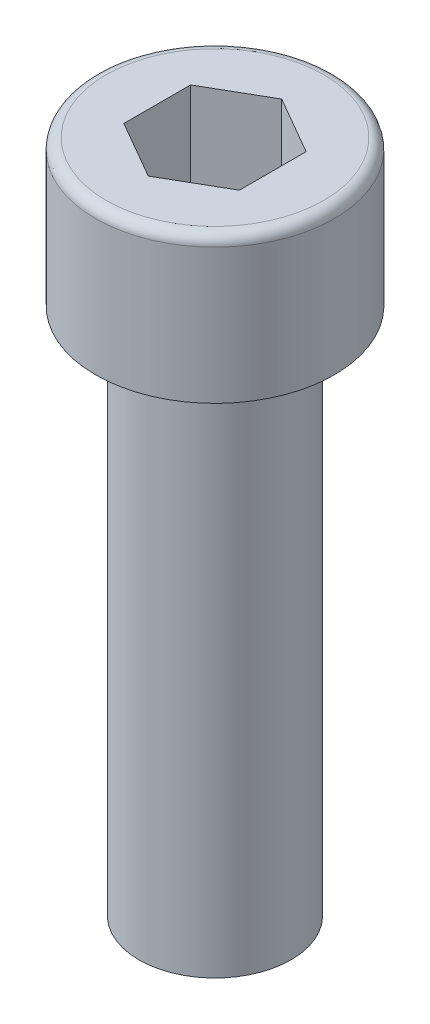
ISO-10303-21;
HEADER;
FILE_DESCRIPTION(('STEP AP214'),'2;1');
FILE_NAME('part.step','',(''),(''),'','','');
FILE_SCHEMA(('AUTOMOTIVE_DESIGN { 1 0 10303 214 1 1 1 1 }'));
ENDSEC;
DATA;
#1=APPLICATION_CONTEXT('core data for automotive mechanical design processes');
#2=APPLICATION_PROTOCOL_DEFINITION('international standard','automotive_design',2000,#1);
#3=PRODUCT_CONTEXT('',#1,'mechanical');
#4=PRODUCT('Part','Part','',(#3));
#5=PRODUCT_RELATED_PRODUCT_CATEGORY('part','',(#4));
#6=PRODUCT_DEFINITION_FORMATION('','',#4);
#7=PRODUCT_DEFINITION_CONTEXT('part definition',#1,'design');
#8=PRODUCT_DEFINITION('design','',#6,#7);
#9=PRODUCT_DEFINITION_SHAPE('','',#8);
#10=(LENGTH_UNIT() NAMED_UNIT(*) SI_UNIT(.MILLI.,.METRE.));
#11=(NAMED_UNIT(*) PLANE_ANGLE_UNIT() SI_UNIT($,.RADIAN.));
#12=(NAMED_UNIT(*) SI_UNIT($,.STERADIAN.) SOLID_ANGLE_UNIT());
#13=UNCERTAINTY_MEASURE_WITH_UNIT(LENGTH_MEASURE(1.E-05),#10,'distance_accuracy_value','');
#14=(GEOMETRIC_REPRESENTATION_CONTEXT(3) GLOBAL_UNCERTAINTY_ASSIGNED_CONTEXT((#13)) GLOBAL_UNIT_ASSIGNED_CONTEXT((#10,
#11,#12)) REPRESENTATION_CONTEXT('',''));
#15=CARTESIAN_POINT('',(0.,0.,0.));
#16=DIRECTION('',(0.,0.,1.));
#17=DIRECTION('',(1.,0.,0.));
#18=AXIS2_PLACEMENT_3D('',#15,#16,#17);
#19=CARTESIAN_POINT('',(0.,-12.7,0.));
#20=DIRECTION('',(0.,1.,0.));
#21=DIRECTION('',(0.,0.,1.));
#22=AXIS2_PLACEMENT_3D('',#19,#20,#21);
#23=CYLINDRICAL_SURFACE('',#22,1.8288);
#24=CARTESIAN_POINT('',(0.,-12.7,0.));
#25=DIRECTION('',(0.,1.,0.));
#26=DIRECTION('',(0.,0.,1.));
#27=AXIS2_PLACEMENT_3D('',#24,#25,#26);
#28=CIRCLE('',#27,1.8288);
#29=CARTESIAN_POINT('',(0.,-12.7,1.8288));
#30=VERTEX_POINT('',#29);
#31=EDGE_CURVE('E143',#30,#30,#28,.T.);
#32=ORIENTED_EDGE('',*,*,#31,.T.);
#33=EDGE_LOOP('',(#32));
#34=FACE_BOUND('',#33,.T.);
#35=CARTESIAN_POINT('',(0.,0.,0.));
#36=DIRECTION('',(0.,1.,0.));
#37=DIRECTION('',(0.,0.,1.));
#38=AXIS2_PLACEMENT_3D('',#35,#36,#37);
#39=CIRCLE('',#38,1.8288);
#40=CARTESIAN_POINT('',(0.,0.,1.8288));
#41=VERTEX_POINT('',#40);
#42=EDGE_CURVE('E142',#41,#41,#39,.T.);
#43=ORIENTED_EDGE('',*,*,#42,.F.);
#44=EDGE_LOOP('',(#43));
#45=FACE_BOUND('',#44,.T.);
#46=ADVANCED_FACE('F32',(#34,#45),#23,.T.);
#47=CARTESIAN_POINT('',(0.,-12.7,0.));
#48=DIRECTION('',(0.,1.,0.));
#49=DIRECTION('',(0.,0.,1.));
#50=AXIS2_PLACEMENT_3D('',#47,#48,#49);
#51=PLANE('',#50);
#52=ORIENTED_EDGE('',*,*,#31,.F.);
#53=EDGE_LOOP('',(#52));
#54=FACE_BOUND('',#53,.T.);
#55=ADVANCED_FACE('F166',(#54),#51,.F.);
#56=CARTESIAN_POINT('',(0.,3.5052,0.));
#57=DIRECTION('',(0.,-1.,0.));
#58=DIRECTION('',(0.,0.,-1.));
#59=AXIS2_PLACEMENT_3D('',#56,#57,#58);
#60=CYLINDRICAL_SURFACE('',#59,2.8702);
#61=CARTESIAN_POINT('',(0.,3.2512,0.));
#62=DIRECTION('',(0.,1.,0.));
#63=DIRECTION('',(0.,0.,1.));
#64=AXIS2_PLACEMENT_3D('',#61,#62,#63);
#65=CIRCLE('',#64,2.8702);
#66=CARTESIAN_POINT('',(0.,3.2512,2.8702));
#67=VERTEX_POINT('',#66);
#68=EDGE_CURVE('E11',#67,#67,#65,.F.);
#69=ORIENTED_EDGE('',*,*,#68,.T.);
#70=EDGE_LOOP('',(#69));
#71=FACE_BOUND('',#70,.T.);
#72=CARTESIAN_POINT('',(0.,0.,0.));
#73=DIRECTION('',(0.,1.,0.));
#74=DIRECTION('',(0.,0.,1.));
#75=AXIS2_PLACEMENT_3D('',#72,#73,#74);
#76=CIRCLE('',#75,2.8702);
#77=CARTESIAN_POINT('',(0.,0.,2.8702));
#78=VERTEX_POINT('',#77);
#79=EDGE_CURVE('E134',#78,#78,#76,.T.);
#80=ORIENTED_EDGE('',*,*,#79,.T.);
#81=EDGE_LOOP('',(#80));
#82=FACE_BOUND('',#81,.T.);
#83=ADVANCED_FACE('F171',(#71,#82),#60,.T.);
#84=CARTESIAN_POINT('',(0.,3.5052,0.));
#85=DIRECTION('',(0.,1.,0.));
#86=DIRECTION('',(0.,0.,1.));
#87=AXIS2_PLACEMENT_3D('',#84,#85,#86);
#88=PLANE('',#87);
#89=DIRECTION('',(-0.866025403784439,0.,-0.5));
#90=VECTOR('',#89,1.);
#91=CARTESIAN_POINT('',(1.3890625,3.5052,-0.801975608296215));
#92=LINE('',#91,#90);
#93=CARTESIAN_POINT('',(1.3890625,3.5052,-0.801975608296215));
#94=VERTEX_POINT('',#93);
#95=CARTESIAN_POINT('',(0.,3.5052,-1.60395121659243));
#96=VERTEX_POINT('',#95);
#97=EDGE_CURVE('E47',#94,#96,#92,.T.);
#98=ORIENTED_EDGE('',*,*,#97,.F.);
#99=DIRECTION('',(0.,0.,-1.));
#100=VECTOR('',#99,1.);
#101=CARTESIAN_POINT('',(1.3890625,3.5052,0.801975608296215));
#102=LINE('',#101,#100);
#103=CARTESIAN_POINT('',(1.3890625,3.5052,0.801975608296215));
#104=VERTEX_POINT('',#103);
#105=EDGE_CURVE('E130',#104,#94,#102,.T.);
#106=ORIENTED_EDGE('',*,*,#105,.F.);
#107=DIRECTION('',(0.866025403784439,0.,-0.5));
#108=VECTOR('',#107,1.);
#109=CARTESIAN_POINT('',(0.,3.5052,1.60395121659243));
#110=LINE('',#109,#108);
#111=CARTESIAN_POINT('',(0.,3.5052,1.60395121659243));
#112=VERTEX_POINT('',#111);
#113=EDGE_CURVE('E128',#112,#104,#110,.T.);
#114=ORIENTED_EDGE('',*,*,#113,.F.);
#115=DIRECTION('',(0.866025403784439,0.,0.5));
#116=VECTOR('',#115,1.);
#117=CARTESIAN_POINT('',(-1.3890625,3.5052,0.801975608296215));
#118=LINE('',#117,#116);
#119=CARTESIAN_POINT('',(-1.3890625,3.5052,0.801975608296215));
#120=VERTEX_POINT('',#119);
#121=EDGE_CURVE('E95',#120,#112,#118,.T.);
#122=ORIENTED_EDGE('',*,*,#121,.F.);
#123=DIRECTION('',(0.,0.,1.));
#124=VECTOR('',#123,1.);
#125=CARTESIAN_POINT('',(-1.3890625,3.5052,-0.801975608296215));
#126=LINE('',#125,#124);
#127=CARTESIAN_POINT('',(-1.3890625,3.5052,-0.801975608296215));
#128=VERTEX_POINT('',#127);
#129=EDGE_CURVE('E124',#128,#120,#126,.T.);
#130=ORIENTED_EDGE('',*,*,#129,.F.);
#131=DIRECTION('',(-0.866025403784439,0.,0.5));
#132=VECTOR('',#131,1.);
#133=CARTESIAN_POINT('',(0.,3.5052,-1.60395121659243));
#134=LINE('',#133,#132);
#135=EDGE_CURVE('E121',#96,#128,#134,.T.);
#136=ORIENTED_EDGE('',*,*,#135,.F.);
#137=EDGE_LOOP('',(#98,#106,#114,#122,#130,#136));
#138=FACE_BOUND('',#137,.T.);
#139=CARTESIAN_POINT('',(0.,3.5052,0.));
#140=DIRECTION('',(0.,1.,0.));
#141=DIRECTION('',(0.,0.,1.));
#142=AXIS2_PLACEMENT_3D('',#139,#140,#141);
#143=CIRCLE('',#142,2.6162);
#144=CARTESIAN_POINT('',(0.,3.5052,2.6162));
#145=VERTEX_POINT('',#144);
#146=EDGE_CURVE('E40',#145,#145,#143,.T.);
#147=ORIENTED_EDGE('',*,*,#146,.T.);
#148=EDGE_LOOP('',(#147));
#149=FACE_BOUND('',#148,.T.);
#150=ADVANCED_FACE('F150',(#138,#149),#88,.T.);
#151=CARTESIAN_POINT('',(0.,0.,0.));
#152=DIRECTION('',(0.,1.,0.));
#153=DIRECTION('',(0.,0.,1.));
#154=AXIS2_PLACEMENT_3D('',#151,#152,#153);
#155=PLANE('',#154);
#156=ORIENTED_EDGE('',*,*,#42,.T.);
#157=EDGE_LOOP('',(#156));
#158=FACE_BOUND('',#157,.T.);
#159=ORIENTED_EDGE('',*,*,#79,.F.);
#160=EDGE_LOOP('',(#159));
#161=FACE_BOUND('',#160,.T.);
#162=ADVANCED_FACE('F154',(#158,#161),#155,.F.);
#163=CARTESIAN_POINT('',(0.,3.2512,0.));
#164=DIRECTION('',(0.,1.,0.));
#165=DIRECTION('',(0.,0.,1.));
#166=AXIS2_PLACEMENT_3D('',#163,#164,#165);
#167=TOROIDAL_SURFACE('',#166,2.6162,0.254);
#168=ORIENTED_EDGE('',*,*,#68,.F.);
#169=EDGE_LOOP('',(#168));
#170=FACE_BOUND('',#169,.T.);
#171=ORIENTED_EDGE('',*,*,#146,.F.);
#172=EDGE_LOOP('',(#171));
#173=FACE_BOUND('',#172,.T.);
#174=ADVANCED_FACE('F34',(#170,#173),#167,.T.);
#175=CARTESIAN_POINT('',(1.3890625,0.9652,-0.801975608296215));
#176=DIRECTION('',(0.5,0.,-0.866025403784439));
#177=DIRECTION('',(-0.866025403784439,0.,-0.5));
#178=AXIS2_PLACEMENT_3D('',#175,#176,#177);
#179=PLANE('',#178);
#180=ORIENTED_EDGE('',*,*,#97,.T.);
#181=DIRECTION('',(0.,1.,0.));
#182=VECTOR('',#181,1.);
#183=CARTESIAN_POINT('',(0.,0.9652,-1.60395121659243));
#184=LINE('',#183,#182);
#185=CARTESIAN_POINT('',(0.,0.9652,-1.60395121659243));
#186=VERTEX_POINT('',#185);
#187=EDGE_CURVE('E77',#186,#96,#184,.T.);
#188=ORIENTED_EDGE('',*,*,#187,.F.);
#189=DIRECTION('',(-0.866025403784439,0.,-0.5));
#190=VECTOR('',#189,1.);
#191=CARTESIAN_POINT('',(1.3890625,0.9652,-0.801975608296215));
#192=LINE('',#191,#190);
#193=CARTESIAN_POINT('',(1.3890625,0.9652,-0.801975608296215));
#194=VERTEX_POINT('',#193);
#195=EDGE_CURVE('E132',#194,#186,#192,.T.);
#196=ORIENTED_EDGE('',*,*,#195,.F.);
#197=DIRECTION('',(0.,1.,0.));
#198=VECTOR('',#197,1.);
#199=CARTESIAN_POINT('',(1.3890625,0.9652,-0.801975608296215));
#200=LINE('',#199,#198);
#201=EDGE_CURVE('E55',#194,#94,#200,.T.);
#202=ORIENTED_EDGE('',*,*,#201,.T.);
#203=EDGE_LOOP('',(#180,#188,#196,#202));
#204=FACE_BOUND('',#203,.T.);
#205=ADVANCED_FACE('F153',(#204),#179,.F.);
#206=CARTESIAN_POINT('',(1.3890625,0.9652,0.801975608296215));
#207=DIRECTION('',(1.,0.,0.));
#208=DIRECTION('',(0.,0.,-1.));
#209=AXIS2_PLACEMENT_3D('',#206,#207,#208);
#210=PLANE('',#209);
#211=ORIENTED_EDGE('',*,*,#105,.T.);
#212=ORIENTED_EDGE('',*,*,#201,.F.);
#213=DIRECTION('',(0.,0.,-1.));
#214=VECTOR('',#213,1.);
#215=CARTESIAN_POINT('',(1.3890625,0.9652,0.801975608296215));
#216=LINE('',#215,#214);
#217=CARTESIAN_POINT('',(1.3890625,0.9652,0.801975608296215));
#218=VERTEX_POINT('',#217);
#219=EDGE_CURVE('E107',#218,#194,#216,.T.);
#220=ORIENTED_EDGE('',*,*,#219,.F.);
#221=DIRECTION('',(0.,1.,0.));
#222=VECTOR('',#221,1.);
#223=CARTESIAN_POINT('',(1.3890625,0.9652,0.801975608296215));
#224=LINE('',#223,#222);
#225=EDGE_CURVE('E99',#218,#104,#224,.T.);
#226=ORIENTED_EDGE('',*,*,#225,.T.);
#227=EDGE_LOOP('',(#211,#212,#220,#226));
#228=FACE_BOUND('',#227,.T.);
#229=ADVANCED_FACE('F160',(#228),#210,.F.);
#230=CARTESIAN_POINT('',(0.,0.9652,1.60395121659243));
#231=DIRECTION('',(0.5,0.,0.866025403784439));
#232=DIRECTION('',(0.866025403784439,0.,-0.5));
#233=AXIS2_PLACEMENT_3D('',#230,#231,#232);
#234=PLANE('',#233);
#235=ORIENTED_EDGE('',*,*,#113,.T.);
#236=ORIENTED_EDGE('',*,*,#225,.F.);
#237=DIRECTION('',(0.866025403784439,0.,-0.5));
#238=VECTOR('',#237,1.);
#239=CARTESIAN_POINT('',(0.,0.9652,1.60395121659243));
#240=LINE('',#239,#238);
#241=CARTESIAN_POINT('',(0.,0.9652,1.60395121659243));
#242=VERTEX_POINT('',#241);
#243=EDGE_CURVE('E103',#242,#218,#240,.T.);
#244=ORIENTED_EDGE('',*,*,#243,.F.);
#245=DIRECTION('',(0.,1.,0.));
#246=VECTOR('',#245,1.);
#247=CARTESIAN_POINT('',(0.,0.9652,1.60395121659243));
#248=LINE('',#247,#246);
#249=EDGE_CURVE('E88',#242,#112,#248,.T.);
#250=ORIENTED_EDGE('',*,*,#249,.T.);
#251=EDGE_LOOP('',(#235,#236,#244,#250));
#252=FACE_BOUND('',#251,.T.);
#253=ADVANCED_FACE('F104',(#252),#234,.F.);
#254=CARTESIAN_POINT('',(-1.3890625,0.9652,0.801975608296215));
#255=DIRECTION('',(-0.5,0.,0.866025403784439));
#256=DIRECTION('',(0.866025403784439,0.,0.5));
#257=AXIS2_PLACEMENT_3D('',#254,#255,#256);
#258=PLANE('',#257);
#259=ORIENTED_EDGE('',*,*,#121,.T.);
#260=ORIENTED_EDGE('',*,*,#249,.F.);
#261=DIRECTION('',(0.866025403784439,0.,0.5));
#262=VECTOR('',#261,1.);
#263=CARTESIAN_POINT('',(-1.3890625,0.9652,0.801975608296215));
#264=LINE('',#263,#262);
#265=CARTESIAN_POINT('',(-1.3890625,0.9652,0.801975608296215));
#266=VERTEX_POINT('',#265);
#267=EDGE_CURVE('E92',#266,#242,#264,.T.);
#268=ORIENTED_EDGE('',*,*,#267,.F.);
#269=DIRECTION('',(0.,1.,0.));
#270=VECTOR('',#269,1.);
#271=CARTESIAN_POINT('',(-1.3890625,0.9652,0.801975608296215));
#272=LINE('',#271,#270);
#273=EDGE_CURVE('E100',#266,#120,#272,.T.);
#274=ORIENTED_EDGE('',*,*,#273,.T.);
#275=EDGE_LOOP('',(#259,#260,#268,#274));
#276=FACE_BOUND('',#275,.T.);
#277=ADVANCED_FACE('F90',(#276),#258,.F.);
#278=CARTESIAN_POINT('',(-1.3890625,0.9652,-0.801975608296215));
#279=DIRECTION('',(-1.,0.,0.));
#280=DIRECTION('',(0.,0.,1.));
#281=AXIS2_PLACEMENT_3D('',#278,#279,#280);
#282=PLANE('',#281);
#283=ORIENTED_EDGE('',*,*,#129,.T.);
#284=ORIENTED_EDGE('',*,*,#273,.F.);
#285=DIRECTION('',(0.,0.,1.));
#286=VECTOR('',#285,1.);
#287=CARTESIAN_POINT('',(-1.3890625,0.9652,-0.801975608296215));
#288=LINE('',#287,#286);
#289=CARTESIAN_POINT('',(-1.3890625,0.9652,-0.801975608296215));
#290=VERTEX_POINT('',#289);
#291=EDGE_CURVE('E113',#290,#266,#288,.T.);
#292=ORIENTED_EDGE('',*,*,#291,.F.);
#293=DIRECTION('',(0.,1.,0.));
#294=VECTOR('',#293,1.);
#295=CARTESIAN_POINT('',(-1.3890625,0.9652,-0.801975608296215));
#296=LINE('',#295,#294);
#297=EDGE_CURVE('E137',#290,#128,#296,.T.);
#298=ORIENTED_EDGE('',*,*,#297,.T.);
#299=EDGE_LOOP('',(#283,#284,#292,#298));
#300=FACE_BOUND('',#299,.T.);
#301=ADVANCED_FACE('F185',(#300),#282,.F.);
#302=CARTESIAN_POINT('',(0.,0.9652,-1.60395121659243));
#303=DIRECTION('',(-0.5,0.,-0.866025403784439));
#304=DIRECTION('',(-0.866025403784439,0.,0.5));
#305=AXIS2_PLACEMENT_3D('',#302,#303,#304);
#306=PLANE('',#305);
#307=ORIENTED_EDGE('',*,*,#135,.T.);
#308=ORIENTED_EDGE('',*,*,#297,.F.);
#309=DIRECTION('',(-0.866025403784439,0.,0.5));
#310=VECTOR('',#309,1.);
#311=CARTESIAN_POINT('',(0.,0.9652,-1.60395121659243));
#312=LINE('',#311,#310);
#313=EDGE_CURVE('E115',#186,#290,#312,.T.);
#314=ORIENTED_EDGE('',*,*,#313,.F.);
#315=ORIENTED_EDGE('',*,*,#187,.T.);
#316=EDGE_LOOP('',(#307,#308,#314,#315));
#317=FACE_BOUND('',#316,.T.);
#318=ADVANCED_FACE('F182',(#317),#306,.F.);
#319=CARTESIAN_POINT('',(0.,0.9652,0.));
#320=DIRECTION('',(0.,1.,0.));
#321=DIRECTION('',(0.,0.,1.));
#322=AXIS2_PLACEMENT_3D('',#319,#320,#321);
#323=PLANE('',#322);
#324=ORIENTED_EDGE('',*,*,#195,.T.);
#325=ORIENTED_EDGE('',*,*,#313,.T.);
#326=ORIENTED_EDGE('',*,*,#291,.T.);
#327=ORIENTED_EDGE('',*,*,#267,.T.);
#328=ORIENTED_EDGE('',*,*,#243,.T.);
#329=ORIENTED_EDGE('',*,*,#219,.T.);
#330=EDGE_LOOP('',(#324,#325,#326,#327,#328,#329));
#331=FACE_BOUND('',#330,.T.);
#332=ADVANCED_FACE('F110',(#331),#323,.T.);
#333=CLOSED_SHELL('',(#46,#55,#83,#150,#162,#174,#205,#229,#253,#277,#301,#318,#332));
#334=MANIFOLD_SOLID_BREP('B2',#333);
#335=ADVANCED_BREP_SHAPE_REPRESENTATION('',(#18,#334),#14);
#336=SHAPE_DEFINITION_REPRESENTATION(#9,#335);
ENDSEC;
END-ISO-10303-21;
